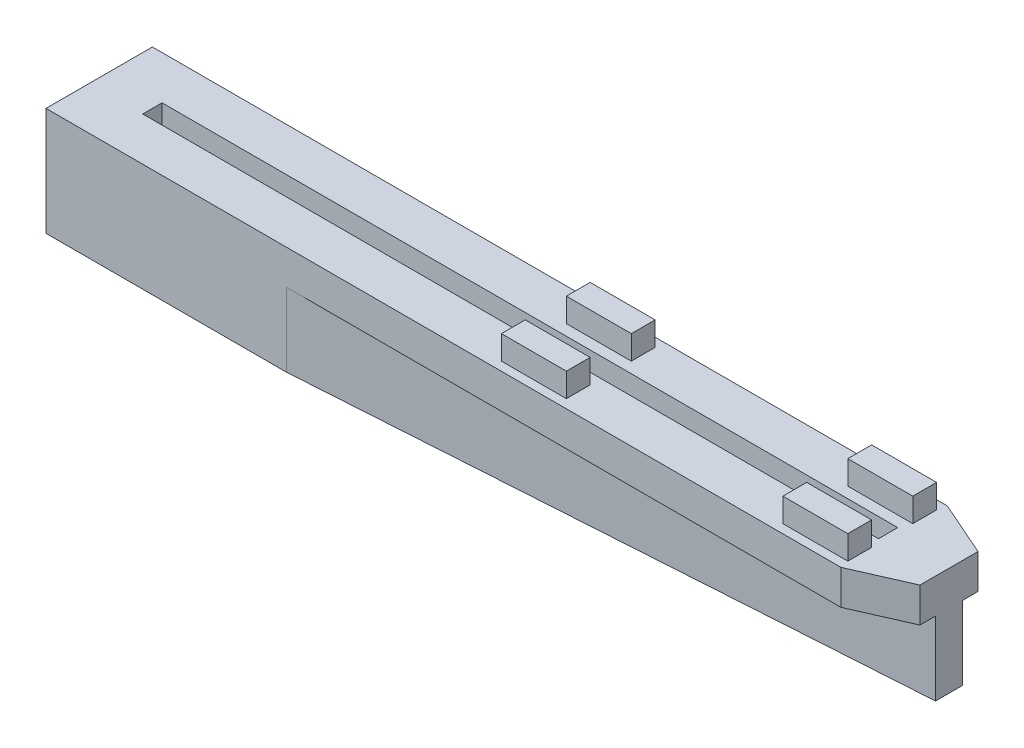
ISO-10303-21;
HEADER;
FILE_DESCRIPTION(('STEP AP214'),'2;1');
FILE_NAME('part.step','',(''),(''),'','','');
FILE_SCHEMA(('AUTOMOTIVE_DESIGN { 1 0 10303 214 1 1 1 1 }'));
ENDSEC;
DATA;
#1=APPLICATION_CONTEXT('core data for automotive mechanical design processes');
#2=APPLICATION_PROTOCOL_DEFINITION('international standard','automotive_design',2000,#1);
#3=PRODUCT_CONTEXT('',#1,'mechanical');
#4=PRODUCT('Part','Part','',(#3));
#5=PRODUCT_RELATED_PRODUCT_CATEGORY('part','',(#4));
#6=PRODUCT_DEFINITION_FORMATION('','',#4);
#7=PRODUCT_DEFINITION_CONTEXT('part definition',#1,'design');
#8=PRODUCT_DEFINITION('design','',#6,#7);
#9=PRODUCT_DEFINITION_SHAPE('','',#8);
#10=(LENGTH_UNIT() NAMED_UNIT(*) SI_UNIT(.MILLI.,.METRE.));
#11=(NAMED_UNIT(*) PLANE_ANGLE_UNIT() SI_UNIT($,.RADIAN.));
#12=(NAMED_UNIT(*) SI_UNIT($,.STERADIAN.) SOLID_ANGLE_UNIT());
#13=UNCERTAINTY_MEASURE_WITH_UNIT(LENGTH_MEASURE(1.E-05),#10,'distance_accuracy_value','');
#14=(GEOMETRIC_REPRESENTATION_CONTEXT(3) GLOBAL_UNCERTAINTY_ASSIGNED_CONTEXT((#13)) GLOBAL_UNIT_ASSIGNED_CONTEXT((#10,
#11,#12)) REPRESENTATION_CONTEXT('',''));
#15=CARTESIAN_POINT('',(0.,0.,0.));
#16=DIRECTION('',(0.,0.,1.));
#17=DIRECTION('',(1.,0.,0.));
#18=AXIS2_PLACEMENT_3D('',#15,#16,#17);
#19=CARTESIAN_POINT('',(0.,5.,0.));
#20=DIRECTION('',(0.,1.,0.));
#21=DIRECTION('',(0.,0.,1.));
#22=AXIS2_PLACEMENT_3D('',#19,#20,#21);
#23=PLANE('',#22);
#24=DIRECTION('',(0.,0.,-1.));
#25=VECTOR('',#24,1.);
#26=CARTESIAN_POINT('',(139.041754007376,5.,0.));
#27=LINE('',#26,#25);
#28=CARTESIAN_POINT('',(139.041754007376,5.00000000000001,-3.60868074220078));
#29=VERTEX_POINT('',#28);
#30=CARTESIAN_POINT('',(139.041754007376,5.00000000000001,-8.06656143383577));
#31=VERTEX_POINT('',#30);
#32=EDGE_CURVE('E445',#29,#31,#27,.T.);
#33=ORIENTED_EDGE('',*,*,#32,.F.);
#34=DIRECTION('',(1.,0.,0.));
#35=VECTOR('',#34,1.);
#36=CARTESIAN_POINT('',(0.,5.,-3.60868074220076));
#37=LINE('',#36,#35);
#38=CARTESIAN_POINT('',(-30.8596042187517,5.,-3.60868074220076));
#39=VERTEX_POINT('',#38);
#40=EDGE_CURVE('E433',#39,#29,#37,.T.);
#41=ORIENTED_EDGE('',*,*,#40,.F.);
#42=DIRECTION('',(0.,0.,1.));
#43=VECTOR('',#42,1.);
#44=CARTESIAN_POINT('',(-30.8596042187517,5.,0.));
#45=LINE('',#44,#43);
#46=CARTESIAN_POINT('',(-30.8596042187517,5.00000000000001,-8.06656143383579));
#47=VERTEX_POINT('',#46);
#48=EDGE_CURVE('E440',#47,#39,#45,.T.);
#49=ORIENTED_EDGE('',*,*,#48,.F.);
#50=DIRECTION('',(-1.,0.,0.));
#51=VECTOR('',#50,1.);
#52=CARTESIAN_POINT('',(0.,5.,-8.06656143383579));
#53=LINE('',#52,#51);
#54=EDGE_CURVE('E443',#31,#47,#53,.T.);
#55=ORIENTED_EDGE('',*,*,#54,.F.);
#56=EDGE_LOOP('',(#33,#41,#49,#55));
#57=FACE_BOUND('',#56,.T.);
#58=DIRECTION('',(0.,0.,1.));
#59=VECTOR('',#58,1.);
#60=CARTESIAN_POINT('',(-43.153560923763,5.,-18.119952768015));
#61=LINE('',#60,#59);
#62=CARTESIAN_POINT('',(-43.153560923763,5.,-18.119952768015));
#63=VERTEX_POINT('',#62);
#64=CARTESIAN_POINT('',(-43.153560923763,5.,6.44471059197847));
#65=VERTEX_POINT('',#64);
#66=EDGE_CURVE('E447',#63,#65,#61,.T.);
#67=ORIENTED_EDGE('',*,*,#66,.T.);
#68=DIRECTION('',(1.,0.,0.));
#69=VECTOR('',#68,1.);
#70=CARTESIAN_POINT('',(-43.153560923763,5.,6.44471059197847));
#71=LINE('',#70,#69);
#72=CARTESIAN_POINT('',(140.433207054609,5.,6.44471059197847));
#73=VERTEX_POINT('',#72);
#74=EDGE_CURVE('E450',#65,#73,#71,.T.);
#75=ORIENTED_EDGE('',*,*,#74,.T.);
#76=DIRECTION('',(0.915136446634434,0.,-0.403144247188648));
#77=VECTOR('',#76,1.);
#78=CARTESIAN_POINT('',(140.433207054609,5.,6.44471059197847));
#79=LINE('',#78,#77);
#80=CARTESIAN_POINT('',(153.094163244286,5.,0.867190790917759));
#81=VERTEX_POINT('',#80);
#82=EDGE_CURVE('E452',#73,#81,#79,.T.);
#83=ORIENTED_EDGE('',*,*,#82,.T.);
#84=DIRECTION('',(0.,0.,-1.));
#85=VECTOR('',#84,1.);
#86=CARTESIAN_POINT('',(153.094163244286,5.,-12.5424329669543));
#87=LINE('',#86,#85);
#88=CARTESIAN_POINT('',(153.094163244286,5.,-12.5424329669543));
#89=VERTEX_POINT('',#88);
#90=EDGE_CURVE('E454',#81,#89,#87,.T.);
#91=ORIENTED_EDGE('',*,*,#90,.T.);
#92=DIRECTION('',(-0.915136446634434,0.,-0.403144247188648));
#93=VECTOR('',#92,1.);
#94=CARTESIAN_POINT('',(140.433207054609,5.,-18.119952768015));
#95=LINE('',#94,#93);
#96=CARTESIAN_POINT('',(140.433207054609,5.,-18.119952768015));
#97=VERTEX_POINT('',#96);
#98=EDGE_CURVE('E456',#89,#97,#95,.T.);
#99=ORIENTED_EDGE('',*,*,#98,.T.);
#100=DIRECTION('',(-1.,0.,0.));
#101=VECTOR('',#100,1.);
#102=CARTESIAN_POINT('',(-43.153560923763,5.,-18.119952768015));
#103=LINE('',#102,#101);
#104=EDGE_CURVE('E458',#97,#63,#103,.T.);
#105=ORIENTED_EDGE('',*,*,#104,.T.);
#106=EDGE_LOOP('',(#67,#75,#83,#91,#99,#105));
#107=FACE_BOUND('',#106,.T.);
#108=DIRECTION('',(0.,0.,1.));
#109=VECTOR('',#108,1.);
#110=CARTESIAN_POINT('',(124.983358294257,5.,-16.0876210880183));
#111=LINE('',#110,#109);
#112=CARTESIAN_POINT('',(124.983358294257,5.,-16.0876210880183));
#113=VERTEX_POINT('',#112);
#114=CARTESIAN_POINT('',(124.983358294257,5.,-10.5876210880183));
#115=VERTEX_POINT('',#114);
#116=EDGE_CURVE('E391',#113,#115,#111,.T.);
#117=ORIENTED_EDGE('',*,*,#116,.F.);
#118=DIRECTION('',(-1.,0.,0.));
#119=VECTOR('',#118,1.);
#120=CARTESIAN_POINT('',(124.983358294257,5.,-16.0876210880183));
#121=LINE('',#120,#119);
#122=CARTESIAN_POINT('',(139.983358294257,5.,-16.0876210880183));
#123=VERTEX_POINT('',#122);
#124=EDGE_CURVE('E418',#123,#113,#121,.T.);
#125=ORIENTED_EDGE('',*,*,#124,.F.);
#126=DIRECTION('',(0.,0.,-1.));
#127=VECTOR('',#126,1.);
#128=CARTESIAN_POINT('',(139.983358294257,5.,-16.0876210880183));
#129=LINE('',#128,#127);
#130=CARTESIAN_POINT('',(139.983358294257,5.,-10.5876210880183));
#131=VERTEX_POINT('',#130);
#132=EDGE_CURVE('E415',#131,#123,#129,.T.);
#133=ORIENTED_EDGE('',*,*,#132,.F.);
#134=DIRECTION('',(1.,0.,0.));
#135=VECTOR('',#134,1.);
#136=CARTESIAN_POINT('',(124.983358294257,5.,-10.5876210880183));
#137=LINE('',#136,#135);
#138=EDGE_CURVE('E412',#115,#131,#137,.T.);
#139=ORIENTED_EDGE('',*,*,#138,.F.);
#140=EDGE_LOOP('',(#117,#125,#133,#139));
#141=FACE_BOUND('',#140,.T.);
#142=DIRECTION('',(1.,0.,0.));
#143=VECTOR('',#142,1.);
#144=CARTESIAN_POINT('',(124.983358294257,5.,4.41237891198167));
#145=LINE('',#144,#143);
#146=CARTESIAN_POINT('',(124.983358294257,5.,4.41237891198167));
#147=VERTEX_POINT('',#146);
#148=CARTESIAN_POINT('',(139.983358294257,5.,4.41237891198165));
#149=VERTEX_POINT('',#148);
#150=EDGE_CURVE('E388',#147,#149,#145,.T.);
#151=ORIENTED_EDGE('',*,*,#150,.F.);
#152=DIRECTION('',(0.,0.,1.));
#153=VECTOR('',#152,1.);
#154=CARTESIAN_POINT('',(124.983358294257,5.,4.41237891198167));
#155=LINE('',#154,#153);
#156=CARTESIAN_POINT('',(124.983358294257,5.,-1.08762108801834));
#157=VERTEX_POINT('',#156);
#158=EDGE_CURVE('E380',#157,#147,#155,.T.);
#159=ORIENTED_EDGE('',*,*,#158,.F.);
#160=DIRECTION('',(-1.,0.,0.));
#161=VECTOR('',#160,1.);
#162=CARTESIAN_POINT('',(124.983358294257,5.,-1.08762108801834));
#163=LINE('',#162,#161);
#164=CARTESIAN_POINT('',(139.983358294257,5.,-1.08762108801835));
#165=VERTEX_POINT('',#164);
#166=EDGE_CURVE('E382',#165,#157,#163,.T.);
#167=ORIENTED_EDGE('',*,*,#166,.F.);
#168=DIRECTION('',(0.,0.,-1.));
#169=VECTOR('',#168,1.);
#170=CARTESIAN_POINT('',(139.983358294257,5.,4.41237891198165));
#171=LINE('',#170,#169);
#172=EDGE_CURVE('E385',#149,#165,#171,.T.);
#173=ORIENTED_EDGE('',*,*,#172,.F.);
#174=EDGE_LOOP('',(#151,#159,#167,#173));
#175=FACE_BOUND('',#174,.T.);
#176=DIRECTION('',(1.,0.,0.));
#177=VECTOR('',#176,1.);
#178=CARTESIAN_POINT('',(59.9833582942569,5.,4.41237891198171));
#179=LINE('',#178,#177);
#180=CARTESIAN_POINT('',(59.9833582942569,5.,4.41237891198171));
#181=VERTEX_POINT('',#180);
#182=CARTESIAN_POINT('',(74.983358294257,5.,4.41237891198169));
#183=VERTEX_POINT('',#182);
#184=EDGE_CURVE('E356',#181,#183,#179,.T.);
#185=ORIENTED_EDGE('',*,*,#184,.F.);
#186=DIRECTION('',(0.,0.,1.));
#187=VECTOR('',#186,1.);
#188=CARTESIAN_POINT('',(59.9833582942569,5.,4.41237891198171));
#189=LINE('',#188,#187);
#190=CARTESIAN_POINT('',(59.9833582942569,5.,-1.0876210880183));
#191=VERTEX_POINT('',#190);
#192=EDGE_CURVE('E348',#191,#181,#189,.T.);
#193=ORIENTED_EDGE('',*,*,#192,.F.);
#194=DIRECTION('',(-1.,0.,0.));
#195=VECTOR('',#194,1.);
#196=CARTESIAN_POINT('',(59.9833582942569,5.,-1.0876210880183));
#197=LINE('',#196,#195);
#198=CARTESIAN_POINT('',(74.983358294257,5.,-1.08762108801831));
#199=VERTEX_POINT('',#198);
#200=EDGE_CURVE('E350',#199,#191,#197,.T.);
#201=ORIENTED_EDGE('',*,*,#200,.F.);
#202=DIRECTION('',(0.,0.,-1.));
#203=VECTOR('',#202,1.);
#204=CARTESIAN_POINT('',(74.983358294257,5.,4.41237891198169));
#205=LINE('',#204,#203);
#206=EDGE_CURVE('E353',#183,#199,#205,.T.);
#207=ORIENTED_EDGE('',*,*,#206,.F.);
#208=EDGE_LOOP('',(#185,#193,#201,#207));
#209=FACE_BOUND('',#208,.T.);
#210=DIRECTION('',(-1.,0.,0.));
#211=VECTOR('',#210,1.);
#212=CARTESIAN_POINT('',(59.9833582942569,5.,-16.0876210880183));
#213=LINE('',#212,#211);
#214=CARTESIAN_POINT('',(74.983358294257,5.,-16.0876210880183));
#215=VERTEX_POINT('',#214);
#216=CARTESIAN_POINT('',(59.9833582942569,5.,-16.0876210880183));
#217=VERTEX_POINT('',#216);
#218=EDGE_CURVE('E324',#215,#217,#213,.T.);
#219=ORIENTED_EDGE('',*,*,#218,.F.);
#220=DIRECTION('',(0.,0.,-1.));
#221=VECTOR('',#220,1.);
#222=CARTESIAN_POINT('',(74.983358294257,5.,-16.0876210880183));
#223=LINE('',#222,#221);
#224=CARTESIAN_POINT('',(74.983358294257,5.,-10.5876210880183));
#225=VERTEX_POINT('',#224);
#226=EDGE_CURVE('E316',#225,#215,#223,.T.);
#227=ORIENTED_EDGE('',*,*,#226,.F.);
#228=DIRECTION('',(1.,0.,0.));
#229=VECTOR('',#228,1.);
#230=CARTESIAN_POINT('',(59.9833582942569,5.,-10.5876210880183));
#231=LINE('',#230,#229);
#232=CARTESIAN_POINT('',(59.9833582942569,5.,-10.5876210880183));
#233=VERTEX_POINT('',#232);
#234=EDGE_CURVE('E318',#233,#225,#231,.T.);
#235=ORIENTED_EDGE('',*,*,#234,.F.);
#236=DIRECTION('',(0.,0.,1.));
#237=VECTOR('',#236,1.);
#238=CARTESIAN_POINT('',(59.9833582942569,5.,-16.0876210880183));
#239=LINE('',#238,#237);
#240=EDGE_CURVE('E321',#217,#233,#239,.T.);
#241=ORIENTED_EDGE('',*,*,#240,.F.);
#242=EDGE_LOOP('',(#219,#227,#235,#241));
#243=FACE_BOUND('',#242,.T.);
#244=ADVANCED_FACE('F39',(#57,#107,#141,#175,#209,#243),#23,.T.);
#245=CARTESIAN_POINT('',(-43.153560923763,5.,-18.119952768015));
#246=DIRECTION('',(1.,0.,0.));
#247=DIRECTION('',(0.,0.,-1.));
#248=AXIS2_PLACEMENT_3D('',#245,#246,#247);
#249=PLANE('',#248);
#250=DIRECTION('',(0.,-1.,0.));
#251=VECTOR('',#250,1.);
#252=CARTESIAN_POINT('',(-43.153560923763,5.,-18.119952768015));
#253=LINE('',#252,#251);
#254=CARTESIAN_POINT('',(-43.153560923763,-20.,-18.119952768015));
#255=VERTEX_POINT('',#254);
#256=EDGE_CURVE('E460',#63,#255,#253,.T.);
#257=ORIENTED_EDGE('',*,*,#256,.T.);
#258=DIRECTION('',(0.,0.,-1.));
#259=VECTOR('',#258,1.);
#260=CARTESIAN_POINT('',(-43.153560923763,-20.,0.));
#261=LINE('',#260,#259);
#262=CARTESIAN_POINT('',(-43.153560923763,-20.,6.44471059197847));
#263=VERTEX_POINT('',#262);
#264=EDGE_CURVE('E282',#263,#255,#261,.T.);
#265=ORIENTED_EDGE('',*,*,#264,.F.);
#266=DIRECTION('',(0.,-1.,0.));
#267=VECTOR('',#266,1.);
#268=CARTESIAN_POINT('',(-43.153560923763,5.,6.44471059197847));
#269=LINE('',#268,#267);
#270=EDGE_CURVE('E11',#65,#263,#269,.T.);
#271=ORIENTED_EDGE('',*,*,#270,.F.);
#272=ORIENTED_EDGE('',*,*,#66,.F.);
#273=EDGE_LOOP('',(#257,#265,#271,#272));
#274=FACE_BOUND('',#273,.T.);
#275=ADVANCED_FACE('F41',(#274),#249,.F.);
#276=CARTESIAN_POINT('',(-43.153560923763,5.,6.44471059197847));
#277=DIRECTION('',(0.,0.,-1.));
#278=DIRECTION('',(-1.,0.,0.));
#279=AXIS2_PLACEMENT_3D('',#276,#277,#278);
#280=PLANE('',#279);
#281=DIRECTION('',(-1.,0.,0.));
#282=VECTOR('',#281,1.);
#283=CARTESIAN_POINT('',(0.,-20.,6.44471059197847));
#284=LINE('',#283,#282);
#285=CARTESIAN_POINT('',(12.387057352953,-20.,6.44471059197847));
#286=VERTEX_POINT('',#285);
#287=EDGE_CURVE('E264',#286,#263,#284,.T.);
#288=ORIENTED_EDGE('',*,*,#287,.F.);
#289=DIRECTION('',(0.,-1.,0.));
#290=VECTOR('',#289,1.);
#291=CARTESIAN_POINT('',(12.387057352953,-3.,6.44471059197847));
#292=LINE('',#291,#290);
#293=CARTESIAN_POINT('',(12.387057352953,-3.,6.44471059197847));
#294=VERTEX_POINT('',#293);
#295=EDGE_CURVE('E62',#294,#286,#292,.T.);
#296=ORIENTED_EDGE('',*,*,#295,.F.);
#297=DIRECTION('',(-1.,0.,0.));
#298=VECTOR('',#297,1.);
#299=CARTESIAN_POINT('',(140.433207054609,-3.,6.44471059197847));
#300=LINE('',#299,#298);
#301=CARTESIAN_POINT('',(140.433207054609,-3.,6.44471059197847));
#302=VERTEX_POINT('',#301);
#303=EDGE_CURVE('E269',#302,#294,#300,.T.);
#304=ORIENTED_EDGE('',*,*,#303,.F.);
#305=DIRECTION('',(0.,-1.,0.));
#306=VECTOR('',#305,1.);
#307=CARTESIAN_POINT('',(140.433207054609,5.,6.44471059197847));
#308=LINE('',#307,#306);
#309=EDGE_CURVE('E47',#73,#302,#308,.T.);
#310=ORIENTED_EDGE('',*,*,#309,.F.);
#311=ORIENTED_EDGE('',*,*,#74,.F.);
#312=ORIENTED_EDGE('',*,*,#270,.T.);
#313=EDGE_LOOP('',(#288,#296,#304,#310,#311,#312));
#314=FACE_BOUND('',#313,.T.);
#315=ADVANCED_FACE('F478',(#314),#280,.F.);
#316=CARTESIAN_POINT('',(140.433207054609,5.,6.44471059197847));
#317=DIRECTION('',(-0.403144247188648,0.,-0.915136446634434));
#318=DIRECTION('',(-0.915136446634434,0.,0.403144247188648));
#319=AXIS2_PLACEMENT_3D('',#316,#317,#318);
#320=PLANE('',#319);
#321=ORIENTED_EDGE('',*,*,#309,.T.);
#322=DIRECTION('',(-0.915136446634435,0.,0.403144247188646));
#323=VECTOR('',#322,1.);
#324=CARTESIAN_POINT('',(153.094163244286,-3.,0.867190790917759));
#325=LINE('',#324,#323);
#326=CARTESIAN_POINT('',(153.094163244286,-3.,0.867190790917759));
#327=VERTEX_POINT('',#326);
#328=EDGE_CURVE('E275',#327,#302,#325,.T.);
#329=ORIENTED_EDGE('',*,*,#328,.F.);
#330=DIRECTION('',(0.,-1.,0.));
#331=VECTOR('',#330,1.);
#332=CARTESIAN_POINT('',(153.094163244286,5.,0.867190790917759));
#333=LINE('',#332,#331);
#334=EDGE_CURVE('E466',#81,#327,#333,.T.);
#335=ORIENTED_EDGE('',*,*,#334,.F.);
#336=ORIENTED_EDGE('',*,*,#82,.F.);
#337=EDGE_LOOP('',(#321,#329,#335,#336));
#338=FACE_BOUND('',#337,.T.);
#339=ADVANCED_FACE('F473',(#338),#320,.F.);
#340=CARTESIAN_POINT('',(153.094163244286,5.,-12.5424329669543));
#341=DIRECTION('',(-1.,0.,0.));
#342=DIRECTION('',(0.,0.,1.));
#343=AXIS2_PLACEMENT_3D('',#340,#341,#342);
#344=PLANE('',#343);
#345=DIRECTION('',(0.,0.,1.));
#346=VECTOR('',#345,1.);
#347=CARTESIAN_POINT('',(153.094163244286,-20.,0.));
#348=LINE('',#347,#346);
#349=CARTESIAN_POINT('',(153.094163244286,-20.,-8.93762108801828));
#350=VERTEX_POINT('',#349);
#351=CARTESIAN_POINT('',(153.094163244286,-20.,-2.73762108801827));
#352=VERTEX_POINT('',#351);
#353=EDGE_CURVE('E287',#350,#352,#348,.T.);
#354=ORIENTED_EDGE('',*,*,#353,.F.);
#355=DIRECTION('',(0.,-1.,0.));
#356=VECTOR('',#355,1.);
#357=CARTESIAN_POINT('',(153.094163244286,-3.,-8.93762108801828));
#358=LINE('',#357,#356);
#359=CARTESIAN_POINT('',(153.094163244286,-3.,-8.93762108801828));
#360=VERTEX_POINT('',#359);
#361=EDGE_CURVE('E54',#360,#350,#358,.T.);
#362=ORIENTED_EDGE('',*,*,#361,.F.);
#363=DIRECTION('',(0.,0.,1.));
#364=VECTOR('',#363,1.);
#365=CARTESIAN_POINT('',(153.094163244286,-3.,-12.5424329669543));
#366=LINE('',#365,#364);
#367=CARTESIAN_POINT('',(153.094163244286,-3.,-12.5424329669543));
#368=VERTEX_POINT('',#367);
#369=EDGE_CURVE('E244',#368,#360,#366,.T.);
#370=ORIENTED_EDGE('',*,*,#369,.F.);
#371=DIRECTION('',(0.,-1.,0.));
#372=VECTOR('',#371,1.);
#373=CARTESIAN_POINT('',(153.094163244286,5.,-12.5424329669543));
#374=LINE('',#373,#372);
#375=EDGE_CURVE('E463',#89,#368,#374,.T.);
#376=ORIENTED_EDGE('',*,*,#375,.F.);
#377=ORIENTED_EDGE('',*,*,#90,.F.);
#378=ORIENTED_EDGE('',*,*,#334,.T.);
#379=DIRECTION('',(0.,0.,1.));
#380=VECTOR('',#379,1.);
#381=CARTESIAN_POINT('',(153.094163244286,-3.,-2.73762108801827));
#382=LINE('',#381,#380);
#383=CARTESIAN_POINT('',(153.094163244286,-3.,-2.73762108801827));
#384=VERTEX_POINT('',#383);
#385=EDGE_CURVE('E277',#384,#327,#382,.T.);
#386=ORIENTED_EDGE('',*,*,#385,.F.);
#387=DIRECTION('',(0.,-1.,0.));
#388=VECTOR('',#387,1.);
#389=CARTESIAN_POINT('',(153.094163244286,-3.,-2.73762108801827));
#390=LINE('',#389,#388);
#391=EDGE_CURVE('E266',#384,#352,#390,.T.);
#392=ORIENTED_EDGE('',*,*,#391,.T.);
#393=EDGE_LOOP('',(#354,#362,#370,#376,#377,#378,#386,#392));
#394=FACE_BOUND('',#393,.T.);
#395=ADVANCED_FACE('F484',(#394),#344,.F.);
#396=CARTESIAN_POINT('',(140.433207054609,5.,-18.119952768015));
#397=DIRECTION('',(-0.403144247188648,0.,0.915136446634434));
#398=DIRECTION('',(0.915136446634434,0.,0.403144247188648));
#399=AXIS2_PLACEMENT_3D('',#396,#397,#398);
#400=PLANE('',#399);
#401=ORIENTED_EDGE('',*,*,#375,.T.);
#402=DIRECTION('',(0.915136446634434,0.,0.403144247188648));
#403=VECTOR('',#402,1.);
#404=CARTESIAN_POINT('',(140.433207054609,-3.,-18.119952768015));
#405=LINE('',#404,#403);
#406=CARTESIAN_POINT('',(140.433207054609,-3.,-18.119952768015));
#407=VERTEX_POINT('',#406);
#408=EDGE_CURVE('E257',#407,#368,#405,.T.);
#409=ORIENTED_EDGE('',*,*,#408,.F.);
#410=DIRECTION('',(0.,-1.,0.));
#411=VECTOR('',#410,1.);
#412=CARTESIAN_POINT('',(140.433207054609,5.,-18.119952768015));
#413=LINE('',#412,#411);
#414=EDGE_CURVE('E256',#97,#407,#413,.T.);
#415=ORIENTED_EDGE('',*,*,#414,.F.);
#416=ORIENTED_EDGE('',*,*,#98,.F.);
#417=EDGE_LOOP('',(#401,#409,#415,#416));
#418=FACE_BOUND('',#417,.T.);
#419=ADVANCED_FACE('F522',(#418),#400,.F.);
#420=CARTESIAN_POINT('',(-43.153560923763,5.,-18.119952768015));
#421=DIRECTION('',(0.,0.,1.));
#422=DIRECTION('',(1.,0.,0.));
#423=AXIS2_PLACEMENT_3D('',#420,#421,#422);
#424=PLANE('',#423);
#425=DIRECTION('',(1.,0.,0.));
#426=VECTOR('',#425,1.);
#427=CARTESIAN_POINT('',(12.387057352953,-3.,-18.119952768015));
#428=LINE('',#427,#426);
#429=CARTESIAN_POINT('',(12.387057352953,-3.,-18.119952768015));
#430=VERTEX_POINT('',#429);
#431=EDGE_CURVE('E248',#430,#407,#428,.T.);
#432=ORIENTED_EDGE('',*,*,#431,.F.);
#433=DIRECTION('',(0.,-1.,0.));
#434=VECTOR('',#433,1.);
#435=CARTESIAN_POINT('',(12.387057352953,-3.,-18.119952768015));
#436=LINE('',#435,#434);
#437=CARTESIAN_POINT('',(12.387057352953,-20.,-18.119952768015));
#438=VERTEX_POINT('',#437);
#439=EDGE_CURVE('E234',#430,#438,#436,.T.);
#440=ORIENTED_EDGE('',*,*,#439,.T.);
#441=DIRECTION('',(1.,0.,0.));
#442=VECTOR('',#441,1.);
#443=CARTESIAN_POINT('',(0.,-20.,-18.119952768015));
#444=LINE('',#443,#442);
#445=EDGE_CURVE('E285',#255,#438,#444,.T.);
#446=ORIENTED_EDGE('',*,*,#445,.F.);
#447=ORIENTED_EDGE('',*,*,#256,.F.);
#448=ORIENTED_EDGE('',*,*,#104,.F.);
#449=ORIENTED_EDGE('',*,*,#414,.T.);
#450=EDGE_LOOP('',(#432,#440,#446,#447,#448,#449));
#451=FACE_BOUND('',#450,.T.);
#452=ADVANCED_FACE('F253',(#451),#424,.F.);
#453=CARTESIAN_POINT('',(139.041754007376,26.,-8.06656143383577));
#454=DIRECTION('',(1.,0.,0.));
#455=DIRECTION('',(0.,0.,-1.));
#456=AXIS2_PLACEMENT_3D('',#453,#454,#455);
#457=PLANE('',#456);
#458=ORIENTED_EDGE('',*,*,#32,.T.);
#459=DIRECTION('',(0.,-1.,0.));
#460=VECTOR('',#459,1.);
#461=CARTESIAN_POINT('',(139.041754007376,26.,-8.06656143383577));
#462=LINE('',#461,#460);
#463=CARTESIAN_POINT('',(139.041754007376,-20.,-8.06656143383577));
#464=VERTEX_POINT('',#463);
#465=EDGE_CURVE('E431',#31,#464,#462,.T.);
#466=ORIENTED_EDGE('',*,*,#465,.T.);
#467=DIRECTION('',(0.,0.,-1.));
#468=VECTOR('',#467,1.);
#469=CARTESIAN_POINT('',(139.041754007376,-20.,0.));
#470=LINE('',#469,#468);
#471=CARTESIAN_POINT('',(139.041754007376,-20.,-3.60868074220078));
#472=VERTEX_POINT('',#471);
#473=EDGE_CURVE('E296',#472,#464,#470,.T.);
#474=ORIENTED_EDGE('',*,*,#473,.F.);
#475=DIRECTION('',(0.,-1.,0.));
#476=VECTOR('',#475,1.);
#477=CARTESIAN_POINT('',(139.041754007376,26.,-3.60868074220078));
#478=LINE('',#477,#476);
#479=EDGE_CURVE('E409',#29,#472,#478,.T.);
#480=ORIENTED_EDGE('',*,*,#479,.F.);
#481=EDGE_LOOP('',(#458,#466,#474,#480));
#482=FACE_BOUND('',#481,.T.);
#483=ADVANCED_FACE('F518',(#482),#457,.F.);
#484=CARTESIAN_POINT('',(139.041754007376,26.,-8.06656143383577));
#485=DIRECTION('',(0.,0.,-1.));
#486=DIRECTION('',(-1.,0.,0.));
#487=AXIS2_PLACEMENT_3D('',#484,#485,#486);
#488=PLANE('',#487);
#489=ORIENTED_EDGE('',*,*,#54,.T.);
#490=DIRECTION('',(0.,-1.,0.));
#491=VECTOR('',#490,1.);
#492=CARTESIAN_POINT('',(-30.8596042187517,26.,-8.06656143383579));
#493=LINE('',#492,#491);
#494=CARTESIAN_POINT('',(-30.8596042187517,-20.,-8.06656143383579));
#495=VERTEX_POINT('',#494);
#496=EDGE_CURVE('E434',#47,#495,#493,.T.);
#497=ORIENTED_EDGE('',*,*,#496,.T.);
#498=DIRECTION('',(-1.,0.,0.));
#499=VECTOR('',#498,1.);
#500=CARTESIAN_POINT('',(0.,-20.,-8.06656143383579));
#501=LINE('',#500,#499);
#502=EDGE_CURVE('E299',#464,#495,#501,.T.);
#503=ORIENTED_EDGE('',*,*,#502,.F.);
#504=ORIENTED_EDGE('',*,*,#465,.F.);
#505=EDGE_LOOP('',(#489,#497,#503,#504));
#506=FACE_BOUND('',#505,.T.);
#507=ADVANCED_FACE('F558',(#506),#488,.F.);
#508=CARTESIAN_POINT('',(-30.8596042187517,26.,-8.06656143383579));
#509=DIRECTION('',(-1.,0.,0.));
#510=DIRECTION('',(0.,0.,1.));
#511=AXIS2_PLACEMENT_3D('',#508,#509,#510);
#512=PLANE('',#511);
#513=ORIENTED_EDGE('',*,*,#48,.T.);
#514=DIRECTION('',(0.,-1.,0.));
#515=VECTOR('',#514,1.);
#516=CARTESIAN_POINT('',(-30.8596042187517,26.,-3.60868074220076));
#517=LINE('',#516,#515);
#518=CARTESIAN_POINT('',(-30.8596042187517,-20.,-3.60868074220076));
#519=VERTEX_POINT('',#518);
#520=EDGE_CURVE('E436',#39,#519,#517,.T.);
#521=ORIENTED_EDGE('',*,*,#520,.T.);
#522=DIRECTION('',(0.,0.,1.));
#523=VECTOR('',#522,1.);
#524=CARTESIAN_POINT('',(-30.8596042187517,-20.,0.));
#525=LINE('',#524,#523);
#526=EDGE_CURVE('E290',#495,#519,#525,.T.);
#527=ORIENTED_EDGE('',*,*,#526,.F.);
#528=ORIENTED_EDGE('',*,*,#496,.F.);
#529=EDGE_LOOP('',(#513,#521,#527,#528));
#530=FACE_BOUND('',#529,.T.);
#531=ADVANCED_FACE('F565',(#530),#512,.F.);
#532=CARTESIAN_POINT('',(139.041754007376,26.,-3.60868074220078));
#533=DIRECTION('',(0.,0.,1.));
#534=DIRECTION('',(1.,0.,0.));
#535=AXIS2_PLACEMENT_3D('',#532,#533,#534);
#536=PLANE('',#535);
#537=ORIENTED_EDGE('',*,*,#40,.T.);
#538=ORIENTED_EDGE('',*,*,#479,.T.);
#539=DIRECTION('',(1.,0.,0.));
#540=VECTOR('',#539,1.);
#541=CARTESIAN_POINT('',(0.,-20.,-3.60868074220076));
#542=LINE('',#541,#540);
#543=EDGE_CURVE('E293',#519,#472,#542,.T.);
#544=ORIENTED_EDGE('',*,*,#543,.F.);
#545=ORIENTED_EDGE('',*,*,#520,.F.);
#546=EDGE_LOOP('',(#537,#538,#544,#545));
#547=FACE_BOUND('',#546,.T.);
#548=ADVANCED_FACE('F573',(#547),#536,.F.);
#549=CARTESIAN_POINT('',(124.983358294257,26.4765453086705,-16.0876210880183));
#550=DIRECTION('',(0.,0.,1.));
#551=DIRECTION('',(1.,0.,0.));
#552=AXIS2_PLACEMENT_3D('',#549,#550,#551);
#553=PLANE('',#552);
#554=DIRECTION('',(0.,-1.,0.));
#555=VECTOR('',#554,1.);
#556=CARTESIAN_POINT('',(124.983358294257,26.4765453086705,-16.0876210880183));
#557=LINE('',#556,#555);
#558=CARTESIAN_POINT('',(124.983358294257,10.5,-16.0876210880183));
#559=VERTEX_POINT('',#558);
#560=EDGE_CURVE('E420',#559,#113,#557,.T.);
#561=ORIENTED_EDGE('',*,*,#560,.F.);
#562=DIRECTION('',(1.,0.,0.));
#563=VECTOR('',#562,1.);
#564=CARTESIAN_POINT('',(124.983358294257,10.5,-16.0876210880183));
#565=LINE('',#564,#563);
#566=CARTESIAN_POINT('',(139.983358294257,10.5,-16.0876210880183));
#567=VERTEX_POINT('',#566);
#568=EDGE_CURVE('E403',#559,#567,#565,.T.);
#569=ORIENTED_EDGE('',*,*,#568,.T.);
#570=DIRECTION('',(0.,-1.,0.));
#571=VECTOR('',#570,1.);
#572=CARTESIAN_POINT('',(139.983358294257,26.4765453086705,-16.0876210880183));
#573=LINE('',#572,#571);
#574=EDGE_CURVE('E423',#567,#123,#573,.T.);
#575=ORIENTED_EDGE('',*,*,#574,.T.);
#576=ORIENTED_EDGE('',*,*,#124,.T.);
#577=EDGE_LOOP('',(#561,#569,#575,#576));
#578=FACE_BOUND('',#577,.T.);
#579=ADVANCED_FACE('F580',(#578),#553,.F.);
#580=CARTESIAN_POINT('',(139.983358294257,26.4765453086705,-16.0876210880183));
#581=DIRECTION('',(-1.,0.,0.));
#582=DIRECTION('',(0.,0.,1.));
#583=AXIS2_PLACEMENT_3D('',#580,#581,#582);
#584=PLANE('',#583);
#585=ORIENTED_EDGE('',*,*,#574,.F.);
#586=DIRECTION('',(0.,0.,1.));
#587=VECTOR('',#586,1.);
#588=CARTESIAN_POINT('',(139.983358294257,10.5,-16.0876210880183));
#589=LINE('',#588,#587);
#590=CARTESIAN_POINT('',(139.983358294257,10.5,-10.5876210880183));
#591=VERTEX_POINT('',#590);
#592=EDGE_CURVE('E399',#567,#591,#589,.T.);
#593=ORIENTED_EDGE('',*,*,#592,.T.);
#594=DIRECTION('',(0.,-1.,0.));
#595=VECTOR('',#594,1.);
#596=CARTESIAN_POINT('',(139.983358294257,26.4765453086705,-10.5876210880183));
#597=LINE('',#596,#595);
#598=EDGE_CURVE('E425',#591,#131,#597,.T.);
#599=ORIENTED_EDGE('',*,*,#598,.T.);
#600=ORIENTED_EDGE('',*,*,#132,.T.);
#601=EDGE_LOOP('',(#585,#593,#599,#600));
#602=FACE_BOUND('',#601,.T.);
#603=ADVANCED_FACE('F587',(#602),#584,.F.);
#604=CARTESIAN_POINT('',(124.983358294257,26.4765453086705,-10.5876210880183));
#605=DIRECTION('',(0.,0.,-1.));
#606=DIRECTION('',(-1.,0.,0.));
#607=AXIS2_PLACEMENT_3D('',#604,#605,#606);
#608=PLANE('',#607);
#609=ORIENTED_EDGE('',*,*,#598,.F.);
#610=DIRECTION('',(-1.,0.,0.));
#611=VECTOR('',#610,1.);
#612=CARTESIAN_POINT('',(124.983358294257,10.5,-10.5876210880183));
#613=LINE('',#612,#611);
#614=CARTESIAN_POINT('',(124.983358294257,10.5,-10.5876210880183));
#615=VERTEX_POINT('',#614);
#616=EDGE_CURVE('E402',#591,#615,#613,.T.);
#617=ORIENTED_EDGE('',*,*,#616,.T.);
#618=DIRECTION('',(0.,-1.,0.));
#619=VECTOR('',#618,1.);
#620=CARTESIAN_POINT('',(124.983358294257,26.4765453086705,-10.5876210880183));
#621=LINE('',#620,#619);
#622=EDGE_CURVE('E427',#615,#115,#621,.T.);
#623=ORIENTED_EDGE('',*,*,#622,.T.);
#624=ORIENTED_EDGE('',*,*,#138,.T.);
#625=EDGE_LOOP('',(#609,#617,#623,#624));
#626=FACE_BOUND('',#625,.T.);
#627=ADVANCED_FACE('F595',(#626),#608,.F.);
#628=CARTESIAN_POINT('',(124.983358294257,26.4765453086705,-16.0876210880183));
#629=DIRECTION('',(1.,0.,0.));
#630=DIRECTION('',(0.,0.,-1.));
#631=AXIS2_PLACEMENT_3D('',#628,#629,#630);
#632=PLANE('',#631);
#633=ORIENTED_EDGE('',*,*,#622,.F.);
#634=DIRECTION('',(0.,0.,-1.));
#635=VECTOR('',#634,1.);
#636=CARTESIAN_POINT('',(124.983358294257,10.5,-16.0876210880183));
#637=LINE('',#636,#635);
#638=EDGE_CURVE('E406',#615,#559,#637,.T.);
#639=ORIENTED_EDGE('',*,*,#638,.T.);
#640=ORIENTED_EDGE('',*,*,#560,.T.);
#641=ORIENTED_EDGE('',*,*,#116,.T.);
#642=EDGE_LOOP('',(#633,#639,#640,#641));
#643=FACE_BOUND('',#642,.T.);
#644=ADVANCED_FACE('F603',(#643),#632,.F.);
#645=CARTESIAN_POINT('',(244.320359702623,10.5,-113.837621088018));
#646=DIRECTION('',(0.,-1.,0.));
#647=DIRECTION('',(-1.,0.,0.));
#648=AXIS2_PLACEMENT_3D('',#645,#646,#647);
#649=PLANE('',#648);
#650=ORIENTED_EDGE('',*,*,#616,.F.);
#651=ORIENTED_EDGE('',*,*,#592,.F.);
#652=ORIENTED_EDGE('',*,*,#568,.F.);
#653=ORIENTED_EDGE('',*,*,#638,.F.);
#654=EDGE_LOOP('',(#650,#651,#652,#653));
#655=FACE_BOUND('',#654,.T.);
#656=ADVANCED_FACE('F611',(#655),#649,.F.);
#657=CARTESIAN_POINT('',(124.983358294257,26.4765453086705,4.41237891198167));
#658=DIRECTION('',(1.,0.,0.));
#659=DIRECTION('',(0.,0.,-1.));
#660=AXIS2_PLACEMENT_3D('',#657,#658,#659);
#661=PLANE('',#660);
#662=DIRECTION('',(0.,-1.,0.));
#663=VECTOR('',#662,1.);
#664=CARTESIAN_POINT('',(124.983358294257,26.4765453086705,4.41237891198167));
#665=LINE('',#664,#663);
#666=CARTESIAN_POINT('',(124.983358294257,10.5,4.41237891198167));
#667=VERTEX_POINT('',#666);
#668=EDGE_CURVE('E377',#667,#147,#665,.T.);
#669=ORIENTED_EDGE('',*,*,#668,.F.);
#670=DIRECTION('',(0.,0.,-1.));
#671=VECTOR('',#670,1.);
#672=CARTESIAN_POINT('',(124.983358294257,10.5,4.41237891198167));
#673=LINE('',#672,#671);
#674=CARTESIAN_POINT('',(124.983358294257,10.5,-1.08762108801834));
#675=VERTEX_POINT('',#674);
#676=EDGE_CURVE('E367',#667,#675,#673,.T.);
#677=ORIENTED_EDGE('',*,*,#676,.T.);
#678=DIRECTION('',(0.,-1.,0.));
#679=VECTOR('',#678,1.);
#680=CARTESIAN_POINT('',(124.983358294257,26.4765453086705,-1.08762108801834));
#681=LINE('',#680,#679);
#682=EDGE_CURVE('E375',#675,#157,#681,.T.);
#683=ORIENTED_EDGE('',*,*,#682,.T.);
#684=ORIENTED_EDGE('',*,*,#158,.T.);
#685=EDGE_LOOP('',(#669,#677,#683,#684));
#686=FACE_BOUND('',#685,.T.);
#687=ADVANCED_FACE('F619',(#686),#661,.F.);
#688=CARTESIAN_POINT('',(124.983358294257,26.4765453086705,-1.08762108801834));
#689=DIRECTION('',(0.,0.,1.));
#690=DIRECTION('',(1.,0.,0.));
#691=AXIS2_PLACEMENT_3D('',#688,#689,#690);
#692=PLANE('',#691);
#693=ORIENTED_EDGE('',*,*,#682,.F.);
#694=DIRECTION('',(1.,0.,0.));
#695=VECTOR('',#694,1.);
#696=CARTESIAN_POINT('',(124.983358294257,10.5,-1.08762108801834));
#697=LINE('',#696,#695);
#698=CARTESIAN_POINT('',(139.983358294257,10.5,-1.08762108801835));
#699=VERTEX_POINT('',#698);
#700=EDGE_CURVE('E371',#675,#699,#697,.T.);
#701=ORIENTED_EDGE('',*,*,#700,.T.);
#702=DIRECTION('',(0.,-1.,0.));
#703=VECTOR('',#702,1.);
#704=CARTESIAN_POINT('',(139.983358294257,26.4765453086705,-1.08762108801835));
#705=LINE('',#704,#703);
#706=EDGE_CURVE('E373',#699,#165,#705,.T.);
#707=ORIENTED_EDGE('',*,*,#706,.T.);
#708=ORIENTED_EDGE('',*,*,#166,.T.);
#709=EDGE_LOOP('',(#693,#701,#707,#708));
#710=FACE_BOUND('',#709,.T.);
#711=ADVANCED_FACE('F627',(#710),#692,.F.);
#712=CARTESIAN_POINT('',(139.983358294257,26.4765453086705,4.41237891198165));
#713=DIRECTION('',(-1.,0.,0.));
#714=DIRECTION('',(0.,0.,1.));
#715=AXIS2_PLACEMENT_3D('',#712,#713,#714);
#716=PLANE('',#715);
#717=ORIENTED_EDGE('',*,*,#706,.F.);
#718=DIRECTION('',(0.,0.,1.));
#719=VECTOR('',#718,1.);
#720=CARTESIAN_POINT('',(139.983358294257,10.5,4.41237891198165));
#721=LINE('',#720,#719);
#722=CARTESIAN_POINT('',(139.983358294257,10.5,4.41237891198165));
#723=VERTEX_POINT('',#722);
#724=EDGE_CURVE('E394',#699,#723,#721,.T.);
#725=ORIENTED_EDGE('',*,*,#724,.T.);
#726=DIRECTION('',(0.,-1.,0.));
#727=VECTOR('',#726,1.);
#728=CARTESIAN_POINT('',(139.983358294257,26.4765453086705,4.41237891198165));
#729=LINE('',#728,#727);
#730=EDGE_CURVE('E370',#723,#149,#729,.T.);
#731=ORIENTED_EDGE('',*,*,#730,.T.);
#732=ORIENTED_EDGE('',*,*,#172,.T.);
#733=EDGE_LOOP('',(#717,#725,#731,#732));
#734=FACE_BOUND('',#733,.T.);
#735=ADVANCED_FACE('F635',(#734),#716,.F.);
#736=CARTESIAN_POINT('',(124.983358294257,26.4765453086705,4.41237891198167));
#737=DIRECTION('',(0.,0.,-1.));
#738=DIRECTION('',(-1.,0.,0.));
#739=AXIS2_PLACEMENT_3D('',#736,#737,#738);
#740=PLANE('',#739);
#741=ORIENTED_EDGE('',*,*,#730,.F.);
#742=DIRECTION('',(-1.,0.,0.));
#743=VECTOR('',#742,1.);
#744=CARTESIAN_POINT('',(124.983358294257,10.5,4.41237891198167));
#745=LINE('',#744,#743);
#746=EDGE_CURVE('E359',#723,#667,#745,.T.);
#747=ORIENTED_EDGE('',*,*,#746,.T.);
#748=ORIENTED_EDGE('',*,*,#668,.T.);
#749=ORIENTED_EDGE('',*,*,#150,.T.);
#750=EDGE_LOOP('',(#741,#747,#748,#749));
#751=FACE_BOUND('',#750,.T.);
#752=ADVANCED_FACE('F643',(#751),#740,.F.);
#753=CARTESIAN_POINT('',(244.320359702623,10.5,-113.837621088018));
#754=DIRECTION('',(0.,-1.,0.));
#755=DIRECTION('',(-1.,0.,0.));
#756=AXIS2_PLACEMENT_3D('',#753,#754,#755);
#757=PLANE('',#756);
#758=ORIENTED_EDGE('',*,*,#724,.F.);
#759=ORIENTED_EDGE('',*,*,#700,.F.);
#760=ORIENTED_EDGE('',*,*,#676,.F.);
#761=ORIENTED_EDGE('',*,*,#746,.F.);
#762=EDGE_LOOP('',(#758,#759,#760,#761));
#763=FACE_BOUND('',#762,.T.);
#764=ADVANCED_FACE('F651',(#763),#757,.F.);
#765=CARTESIAN_POINT('',(59.9833582942569,26.4765453086705,4.41237891198171));
#766=DIRECTION('',(1.,0.,0.));
#767=DIRECTION('',(0.,0.,-1.));
#768=AXIS2_PLACEMENT_3D('',#765,#766,#767);
#769=PLANE('',#768);
#770=DIRECTION('',(0.,-1.,0.));
#771=VECTOR('',#770,1.);
#772=CARTESIAN_POINT('',(59.9833582942569,26.4765453086705,4.41237891198171));
#773=LINE('',#772,#771);
#774=CARTESIAN_POINT('',(59.9833582942569,10.5,4.41237891198171));
#775=VERTEX_POINT('',#774);
#776=EDGE_CURVE('E345',#775,#181,#773,.T.);
#777=ORIENTED_EDGE('',*,*,#776,.F.);
#778=DIRECTION('',(0.,0.,-1.));
#779=VECTOR('',#778,1.);
#780=CARTESIAN_POINT('',(59.9833582942569,10.5,4.41237891198171));
#781=LINE('',#780,#779);
#782=CARTESIAN_POINT('',(59.9833582942569,10.5,-1.0876210880183));
#783=VERTEX_POINT('',#782);
#784=EDGE_CURVE('E335',#775,#783,#781,.T.);
#785=ORIENTED_EDGE('',*,*,#784,.T.);
#786=DIRECTION('',(0.,-1.,0.));
#787=VECTOR('',#786,1.);
#788=CARTESIAN_POINT('',(59.9833582942569,26.4765453086705,-1.0876210880183));
#789=LINE('',#788,#787);
#790=EDGE_CURVE('E343',#783,#191,#789,.T.);
#791=ORIENTED_EDGE('',*,*,#790,.T.);
#792=ORIENTED_EDGE('',*,*,#192,.T.);
#793=EDGE_LOOP('',(#777,#785,#791,#792));
#794=FACE_BOUND('',#793,.T.);
#795=ADVANCED_FACE('F659',(#794),#769,.F.);
#796=CARTESIAN_POINT('',(59.9833582942569,26.4765453086705,-1.0876210880183));
#797=DIRECTION('',(0.,0.,1.));
#798=DIRECTION('',(1.,0.,0.));
#799=AXIS2_PLACEMENT_3D('',#796,#797,#798);
#800=PLANE('',#799);
#801=ORIENTED_EDGE('',*,*,#790,.F.);
#802=DIRECTION('',(1.,0.,0.));
#803=VECTOR('',#802,1.);
#804=CARTESIAN_POINT('',(59.9833582942569,10.5,-1.0876210880183));
#805=LINE('',#804,#803);
#806=CARTESIAN_POINT('',(74.983358294257,10.5,-1.08762108801831));
#807=VERTEX_POINT('',#806);
#808=EDGE_CURVE('E339',#783,#807,#805,.T.);
#809=ORIENTED_EDGE('',*,*,#808,.T.);
#810=DIRECTION('',(0.,-1.,0.));
#811=VECTOR('',#810,1.);
#812=CARTESIAN_POINT('',(74.983358294257,26.4765453086705,-1.08762108801831));
#813=LINE('',#812,#811);
#814=EDGE_CURVE('E341',#807,#199,#813,.T.);
#815=ORIENTED_EDGE('',*,*,#814,.T.);
#816=ORIENTED_EDGE('',*,*,#200,.T.);
#817=EDGE_LOOP('',(#801,#809,#815,#816));
#818=FACE_BOUND('',#817,.T.);
#819=ADVANCED_FACE('F667',(#818),#800,.F.);
#820=CARTESIAN_POINT('',(74.983358294257,26.4765453086705,4.41237891198169));
#821=DIRECTION('',(-1.,0.,0.));
#822=DIRECTION('',(0.,0.,1.));
#823=AXIS2_PLACEMENT_3D('',#820,#821,#822);
#824=PLANE('',#823);
#825=ORIENTED_EDGE('',*,*,#814,.F.);
#826=DIRECTION('',(0.,0.,1.));
#827=VECTOR('',#826,1.);
#828=CARTESIAN_POINT('',(74.983358294257,10.5,4.41237891198169));
#829=LINE('',#828,#827);
#830=CARTESIAN_POINT('',(74.983358294257,10.5,4.41237891198169));
#831=VERTEX_POINT('',#830);
#832=EDGE_CURVE('E362',#807,#831,#829,.T.);
#833=ORIENTED_EDGE('',*,*,#832,.T.);
#834=DIRECTION('',(0.,-1.,0.));
#835=VECTOR('',#834,1.);
#836=CARTESIAN_POINT('',(74.983358294257,26.4765453086705,4.41237891198169));
#837=LINE('',#836,#835);
#838=EDGE_CURVE('E338',#831,#183,#837,.T.);
#839=ORIENTED_EDGE('',*,*,#838,.T.);
#840=ORIENTED_EDGE('',*,*,#206,.T.);
#841=EDGE_LOOP('',(#825,#833,#839,#840));
#842=FACE_BOUND('',#841,.T.);
#843=ADVANCED_FACE('F675',(#842),#824,.F.);
#844=CARTESIAN_POINT('',(59.9833582942569,26.4765453086705,4.41237891198171));
#845=DIRECTION('',(0.,0.,-1.));
#846=DIRECTION('',(-1.,0.,0.));
#847=AXIS2_PLACEMENT_3D('',#844,#845,#846);
#848=PLANE('',#847);
#849=ORIENTED_EDGE('',*,*,#838,.F.);
#850=DIRECTION('',(-1.,0.,0.));
#851=VECTOR('',#850,1.);
#852=CARTESIAN_POINT('',(59.9833582942569,10.5,4.41237891198171));
#853=LINE('',#852,#851);
#854=EDGE_CURVE('E327',#831,#775,#853,.T.);
#855=ORIENTED_EDGE('',*,*,#854,.T.);
#856=ORIENTED_EDGE('',*,*,#776,.T.);
#857=ORIENTED_EDGE('',*,*,#184,.T.);
#858=EDGE_LOOP('',(#849,#855,#856,#857));
#859=FACE_BOUND('',#858,.T.);
#860=ADVANCED_FACE('F683',(#859),#848,.F.);
#861=CARTESIAN_POINT('',(244.320359702623,10.5,-113.837621088018));
#862=DIRECTION('',(0.,-1.,0.));
#863=DIRECTION('',(-1.,0.,0.));
#864=AXIS2_PLACEMENT_3D('',#861,#862,#863);
#865=PLANE('',#864);
#866=ORIENTED_EDGE('',*,*,#832,.F.);
#867=ORIENTED_EDGE('',*,*,#808,.F.);
#868=ORIENTED_EDGE('',*,*,#784,.F.);
#869=ORIENTED_EDGE('',*,*,#854,.F.);
#870=EDGE_LOOP('',(#866,#867,#868,#869));
#871=FACE_BOUND('',#870,.T.);
#872=ADVANCED_FACE('F691',(#871),#865,.F.);
#873=CARTESIAN_POINT('',(74.983358294257,26.4765453086705,-16.0876210880183));
#874=DIRECTION('',(-1.,0.,0.));
#875=DIRECTION('',(0.,0.,1.));
#876=AXIS2_PLACEMENT_3D('',#873,#874,#875);
#877=PLANE('',#876);
#878=DIRECTION('',(0.,-1.,0.));
#879=VECTOR('',#878,1.);
#880=CARTESIAN_POINT('',(74.983358294257,26.4765453086705,-16.0876210880183));
#881=LINE('',#880,#879);
#882=CARTESIAN_POINT('',(74.983358294257,10.5,-16.0876210880183));
#883=VERTEX_POINT('',#882);
#884=EDGE_CURVE('E313',#883,#215,#881,.T.);
#885=ORIENTED_EDGE('',*,*,#884,.F.);
#886=DIRECTION('',(0.,0.,1.));
#887=VECTOR('',#886,1.);
#888=CARTESIAN_POINT('',(74.983358294257,10.5,-16.0876210880183));
#889=LINE('',#888,#887);
#890=CARTESIAN_POINT('',(74.983358294257,10.5,-10.5876210880183));
#891=VERTEX_POINT('',#890);
#892=EDGE_CURVE('E303',#883,#891,#889,.T.);
#893=ORIENTED_EDGE('',*,*,#892,.T.);
#894=DIRECTION('',(0.,-1.,0.));
#895=VECTOR('',#894,1.);
#896=CARTESIAN_POINT('',(74.983358294257,26.4765453086705,-10.5876210880183));
#897=LINE('',#896,#895);
#898=EDGE_CURVE('E311',#891,#225,#897,.T.);
#899=ORIENTED_EDGE('',*,*,#898,.T.);
#900=ORIENTED_EDGE('',*,*,#226,.T.);
#901=EDGE_LOOP('',(#885,#893,#899,#900));
#902=FACE_BOUND('',#901,.T.);
#903=ADVANCED_FACE('F699',(#902),#877,.F.);
#904=CARTESIAN_POINT('',(59.9833582942569,26.4765453086705,-10.5876210880183));
#905=DIRECTION('',(0.,0.,-1.));
#906=DIRECTION('',(-1.,0.,0.));
#907=AXIS2_PLACEMENT_3D('',#904,#905,#906);
#908=PLANE('',#907);
#909=ORIENTED_EDGE('',*,*,#898,.F.);
#910=DIRECTION('',(-1.,0.,0.));
#911=VECTOR('',#910,1.);
#912=CARTESIAN_POINT('',(59.9833582942569,10.5,-10.5876210880183));
#913=LINE('',#912,#911);
#914=CARTESIAN_POINT('',(59.9833582942569,10.5,-10.5876210880183));
#915=VERTEX_POINT('',#914);
#916=EDGE_CURVE('E307',#891,#915,#913,.T.);
#917=ORIENTED_EDGE('',*,*,#916,.T.);
#918=DIRECTION('',(0.,-1.,0.));
#919=VECTOR('',#918,1.);
#920=CARTESIAN_POINT('',(59.9833582942569,26.4765453086705,-10.5876210880183));
#921=LINE('',#920,#919);
#922=EDGE_CURVE('E309',#915,#233,#921,.T.);
#923=ORIENTED_EDGE('',*,*,#922,.T.);
#924=ORIENTED_EDGE('',*,*,#234,.T.);
#925=EDGE_LOOP('',(#909,#917,#923,#924));
#926=FACE_BOUND('',#925,.T.);
#927=ADVANCED_FACE('F707',(#926),#908,.F.);
#928=CARTESIAN_POINT('',(59.9833582942569,26.4765453086705,-16.0876210880183));
#929=DIRECTION('',(1.,0.,0.));
#930=DIRECTION('',(0.,0.,-1.));
#931=AXIS2_PLACEMENT_3D('',#928,#929,#930);
#932=PLANE('',#931);
#933=ORIENTED_EDGE('',*,*,#922,.F.);
#934=DIRECTION('',(0.,0.,-1.));
#935=VECTOR('',#934,1.);
#936=CARTESIAN_POINT('',(59.9833582942569,10.5,-16.0876210880183));
#937=LINE('',#936,#935);
#938=CARTESIAN_POINT('',(59.9833582942569,10.5,-16.0876210880183));
#939=VERTEX_POINT('',#938);
#940=EDGE_CURVE('E330',#915,#939,#937,.T.);
#941=ORIENTED_EDGE('',*,*,#940,.T.);
#942=DIRECTION('',(0.,-1.,0.));
#943=VECTOR('',#942,1.);
#944=CARTESIAN_POINT('',(59.9833582942569,26.4765453086705,-16.0876210880183));
#945=LINE('',#944,#943);
#946=EDGE_CURVE('E306',#939,#217,#945,.T.);
#947=ORIENTED_EDGE('',*,*,#946,.T.);
#948=ORIENTED_EDGE('',*,*,#240,.T.);
#949=EDGE_LOOP('',(#933,#941,#947,#948));
#950=FACE_BOUND('',#949,.T.);
#951=ADVANCED_FACE('F715',(#950),#932,.F.);
#952=CARTESIAN_POINT('',(59.9833582942569,26.4765453086705,-16.0876210880183));
#953=DIRECTION('',(0.,0.,1.));
#954=DIRECTION('',(1.,0.,0.));
#955=AXIS2_PLACEMENT_3D('',#952,#953,#954);
#956=PLANE('',#955);
#957=ORIENTED_EDGE('',*,*,#946,.F.);
#958=DIRECTION('',(1.,0.,0.));
#959=VECTOR('',#958,1.);
#960=CARTESIAN_POINT('',(59.9833582942569,10.5,-16.0876210880183));
#961=LINE('',#960,#959);
#962=EDGE_CURVE('E302',#939,#883,#961,.T.);
#963=ORIENTED_EDGE('',*,*,#962,.T.);
#964=ORIENTED_EDGE('',*,*,#884,.T.);
#965=ORIENTED_EDGE('',*,*,#218,.T.);
#966=EDGE_LOOP('',(#957,#963,#964,#965));
#967=FACE_BOUND('',#966,.T.);
#968=ADVANCED_FACE('F723',(#967),#956,.F.);
#969=CARTESIAN_POINT('',(244.320359702623,10.5,-113.837621088018));
#970=DIRECTION('',(0.,-1.,0.));
#971=DIRECTION('',(-1.,0.,0.));
#972=AXIS2_PLACEMENT_3D('',#969,#970,#971);
#973=PLANE('',#972);
#974=ORIENTED_EDGE('',*,*,#940,.F.);
#975=ORIENTED_EDGE('',*,*,#916,.F.);
#976=ORIENTED_EDGE('',*,*,#892,.F.);
#977=ORIENTED_EDGE('',*,*,#962,.F.);
#978=EDGE_LOOP('',(#974,#975,#976,#977));
#979=FACE_BOUND('',#978,.T.);
#980=ADVANCED_FACE('F506',(#979),#973,.F.);
#981=CARTESIAN_POINT('',(0.,-20.,0.));
#982=DIRECTION('',(0.,-1.,0.));
#983=DIRECTION('',(0.,0.,-1.));
#984=AXIS2_PLACEMENT_3D('',#981,#982,#983);
#985=PLANE('',#984);
#986=DIRECTION('',(-0.997877442527036,0.,-0.0651199638797668));
#987=VECTOR('',#986,1.);
#988=CARTESIAN_POINT('',(153.094163244286,-20.,-8.93762108801828));
#989=LINE('',#988,#987);
#990=EDGE_CURVE('E239',#350,#438,#989,.T.);
#991=ORIENTED_EDGE('',*,*,#990,.F.);
#992=ORIENTED_EDGE('',*,*,#353,.T.);
#993=DIRECTION('',(0.997877442527036,0.,-0.0651199638797668));
#994=VECTOR('',#993,1.);
#995=CARTESIAN_POINT('',(153.094163244286,-20.,-2.73762108801827));
#996=LINE('',#995,#994);
#997=EDGE_CURVE('E263',#286,#352,#996,.T.);
#998=ORIENTED_EDGE('',*,*,#997,.F.);
#999=ORIENTED_EDGE('',*,*,#287,.T.);
#1000=ORIENTED_EDGE('',*,*,#264,.T.);
#1001=ORIENTED_EDGE('',*,*,#445,.T.);
#1002=EDGE_LOOP('',(#991,#992,#998,#999,#1000,#1001));
#1003=FACE_BOUND('',#1002,.T.);
#1004=ORIENTED_EDGE('',*,*,#526,.T.);
#1005=ORIENTED_EDGE('',*,*,#543,.T.);
#1006=ORIENTED_EDGE('',*,*,#473,.T.);
#1007=ORIENTED_EDGE('',*,*,#502,.T.);
#1008=EDGE_LOOP('',(#1004,#1005,#1006,#1007));
#1009=FACE_BOUND('',#1008,.T.);
#1010=ADVANCED_FACE('F496',(#1003,#1009),#985,.T.);
#1011=CARTESIAN_POINT('',(153.094163244286,-3.,-2.73762108801827));
#1012=DIRECTION('',(-0.0651199638797668,0.,-0.997877442527036));
#1013=DIRECTION('',(-0.997877442527036,0.,0.0651199638797668));
#1014=AXIS2_PLACEMENT_3D('',#1011,#1012,#1013);
#1015=PLANE('',#1014);
#1016=ORIENTED_EDGE('',*,*,#997,.T.);
#1017=ORIENTED_EDGE('',*,*,#391,.F.);
#1018=DIRECTION('',(0.997877442527036,0.,-0.0651199638797668));
#1019=VECTOR('',#1018,1.);
#1020=CARTESIAN_POINT('',(153.094163244286,-3.,-2.73762108801827));
#1021=LINE('',#1020,#1019);
#1022=EDGE_CURVE('E272',#294,#384,#1021,.T.);
#1023=ORIENTED_EDGE('',*,*,#1022,.F.);
#1024=ORIENTED_EDGE('',*,*,#295,.T.);
#1025=EDGE_LOOP('',(#1016,#1017,#1023,#1024));
#1026=FACE_BOUND('',#1025,.T.);
#1027=ADVANCED_FACE('F498',(#1026),#1015,.F.);
#1028=CARTESIAN_POINT('',(0.,-2.99999999999999,0.));
#1029=DIRECTION('',(0.,1.,0.));
#1030=DIRECTION('',(0.,0.,1.));
#1031=AXIS2_PLACEMENT_3D('',#1028,#1029,#1030);
#1032=PLANE('',#1031);
#1033=ORIENTED_EDGE('',*,*,#1022,.T.);
#1034=ORIENTED_EDGE('',*,*,#385,.T.);
#1035=ORIENTED_EDGE('',*,*,#328,.T.);
#1036=ORIENTED_EDGE('',*,*,#303,.T.);
#1037=EDGE_LOOP('',(#1033,#1034,#1035,#1036));
#1038=FACE_BOUND('',#1037,.T.);
#1039=ADVANCED_FACE('F480',(#1038),#1032,.F.);
#1040=CARTESIAN_POINT('',(153.094163244286,-3.,-8.93762108801828));
#1041=DIRECTION('',(-0.0651199638797668,0.,0.997877442527036));
#1042=DIRECTION('',(0.997877442527036,0.,0.0651199638797668));
#1043=AXIS2_PLACEMENT_3D('',#1040,#1041,#1042);
#1044=PLANE('',#1043);
#1045=ORIENTED_EDGE('',*,*,#990,.T.);
#1046=ORIENTED_EDGE('',*,*,#439,.F.);
#1047=DIRECTION('',(-0.997877442527036,0.,-0.0651199638797668));
#1048=VECTOR('',#1047,1.);
#1049=CARTESIAN_POINT('',(153.094163244286,-3.,-8.93762108801828));
#1050=LINE('',#1049,#1048);
#1051=EDGE_CURVE('E237',#360,#430,#1050,.T.);
#1052=ORIENTED_EDGE('',*,*,#1051,.F.);
#1053=ORIENTED_EDGE('',*,*,#361,.T.);
#1054=EDGE_LOOP('',(#1045,#1046,#1052,#1053));
#1055=FACE_BOUND('',#1054,.T.);
#1056=ADVANCED_FACE('F236',(#1055),#1044,.F.);
#1057=CARTESIAN_POINT('',(0.,-2.99999999999999,0.));
#1058=DIRECTION('',(0.,1.,0.));
#1059=DIRECTION('',(0.,0.,1.));
#1060=AXIS2_PLACEMENT_3D('',#1057,#1058,#1059);
#1061=PLANE('',#1060);
#1062=ORIENTED_EDGE('',*,*,#1051,.T.);
#1063=ORIENTED_EDGE('',*,*,#431,.T.);
#1064=ORIENTED_EDGE('',*,*,#408,.T.);
#1065=ORIENTED_EDGE('',*,*,#369,.T.);
#1066=EDGE_LOOP('',(#1062,#1063,#1064,#1065));
#1067=FACE_BOUND('',#1066,.T.);
#1068=ADVANCED_FACE('F247',(#1067),#1061,.F.);
#1069=CLOSED_SHELL('',(#244,#275,#315,#339,#395,#419,#452,#483,#507,#531,#548,#579,#603,#627,
#644,#656,#687,#711,#735,#752,#764,#795,#819,#843,#860,#872,#903,#927,#951,#968,#980,#1010,
#1027,#1039,#1056,#1068));
#1070=MANIFOLD_SOLID_BREP('B2',#1069);
#1071=ADVANCED_BREP_SHAPE_REPRESENTATION('',(#18,#1070),#14);
#1072=SHAPE_DEFINITION_REPRESENTATION(#9,#1071);
ENDSEC;
END-ISO-10303-21;
